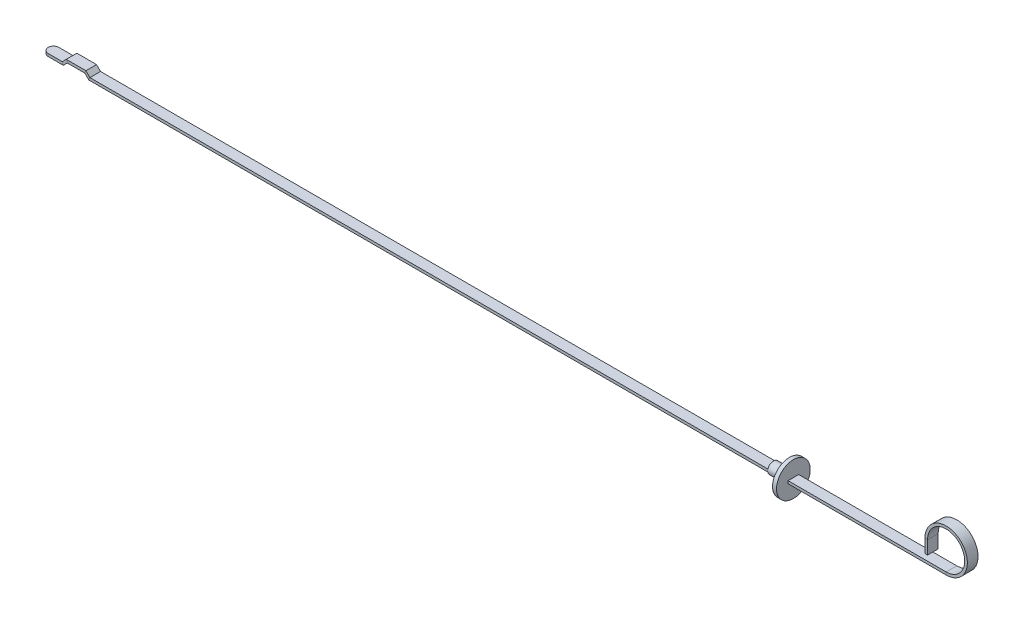
ISO-10303-21;
HEADER;
FILE_DESCRIPTION(('STEP AP214'),'2;1');
FILE_NAME('part.step','',(''),(''),'','','');
FILE_SCHEMA(('AUTOMOTIVE_DESIGN { 1 0 10303 214 1 1 1 1 }'));
ENDSEC;
DATA;
#1=APPLICATION_CONTEXT('core data for automotive mechanical design processes');
#2=APPLICATION_PROTOCOL_DEFINITION('international standard','automotive_design',2000,#1);
#3=PRODUCT_CONTEXT('',#1,'mechanical');
#4=PRODUCT('Part','Part','',(#3));
#5=PRODUCT_RELATED_PRODUCT_CATEGORY('part','',(#4));
#6=PRODUCT_DEFINITION_FORMATION('','',#4);
#7=PRODUCT_DEFINITION_CONTEXT('part definition',#1,'design');
#8=PRODUCT_DEFINITION('design','',#6,#7);
#9=PRODUCT_DEFINITION_SHAPE('','',#8);
#10=(LENGTH_UNIT() NAMED_UNIT(*) SI_UNIT(.MILLI.,.METRE.));
#11=(NAMED_UNIT(*) PLANE_ANGLE_UNIT() SI_UNIT($,.RADIAN.));
#12=(NAMED_UNIT(*) SI_UNIT($,.STERADIAN.) SOLID_ANGLE_UNIT());
#13=UNCERTAINTY_MEASURE_WITH_UNIT(LENGTH_MEASURE(1.E-05),#10,'distance_accuracy_value','');
#14=(GEOMETRIC_REPRESENTATION_CONTEXT(3) GLOBAL_UNCERTAINTY_ASSIGNED_CONTEXT((#13)) GLOBAL_UNIT_ASSIGNED_CONTEXT((#10,
#11,#12)) REPRESENTATION_CONTEXT('',''));
#15=CARTESIAN_POINT('',(0.,0.,0.));
#16=DIRECTION('',(0.,0.,1.));
#17=DIRECTION('',(1.,0.,0.));
#18=AXIS2_PLACEMENT_3D('',#15,#16,#17);
#19=CARTESIAN_POINT('',(-9.,4.35,0.));
#20=DIRECTION('',(-1.,0.,0.));
#21=DIRECTION('',(0.,-1.,0.));
#22=AXIS2_PLACEMENT_3D('',#19,#20,#21);
#23=PLANE('',#22);
#24=DIRECTION('',(0.,-1.,0.));
#25=VECTOR('',#24,1.);
#26=CARTESIAN_POINT('',(-9.,4.35,-4.));
#27=LINE('',#26,#25);
#28=CARTESIAN_POINT('',(-9.,1.,-4.));
#29=VERTEX_POINT('',#28);
#30=CARTESIAN_POINT('',(-9.,-1.,-4.));
#31=VERTEX_POINT('',#30);
#32=EDGE_CURVE('E443',#29,#31,#27,.T.);
#33=ORIENTED_EDGE('',*,*,#32,.F.);
#34=DIRECTION('',(0.,0.,-1.));
#35=VECTOR('',#34,1.);
#36=CARTESIAN_POINT('',(-9.,1.,0.));
#37=LINE('',#36,#35);
#38=CARTESIAN_POINT('',(-9.,1.,4.));
#39=VERTEX_POINT('',#38);
#40=EDGE_CURVE('E439',#39,#29,#37,.T.);
#41=ORIENTED_EDGE('',*,*,#40,.F.);
#42=DIRECTION('',(0.,1.,0.));
#43=VECTOR('',#42,1.);
#44=CARTESIAN_POINT('',(-9.,4.35,4.));
#45=LINE('',#44,#43);
#46=CARTESIAN_POINT('',(-9.00000000000001,-1.,4.));
#47=VERTEX_POINT('',#46);
#48=EDGE_CURVE('E241',#47,#39,#45,.T.);
#49=ORIENTED_EDGE('',*,*,#48,.F.);
#50=DIRECTION('',(0.,0.,1.));
#51=VECTOR('',#50,1.);
#52=CARTESIAN_POINT('',(-9.,-1.,0.));
#53=LINE('',#52,#51);
#54=EDGE_CURVE('E235',#31,#47,#53,.T.);
#55=ORIENTED_EDGE('',*,*,#54,.F.);
#56=EDGE_LOOP('',(#33,#41,#49,#55));
#57=FACE_BOUND('',#56,.T.);
#58=CARTESIAN_POINT('',(-9.,0.,0.));
#59=DIRECTION('',(1.,0.,0.));
#60=DIRECTION('',(0.,1.,0.));
#61=AXIS2_PLACEMENT_3D('',#58,#59,#60);
#62=CIRCLE('',#61,4.35);
#63=CARTESIAN_POINT('',(-9.,4.35,0.));
#64=VERTEX_POINT('',#63);
#65=EDGE_CURVE('E452',#64,#64,#62,.T.);
#66=ORIENTED_EDGE('',*,*,#65,.F.);
#67=EDGE_LOOP('',(#66));
#68=FACE_BOUND('',#67,.T.);
#69=ADVANCED_FACE('F51',(#57,#68),#23,.T.);
#70=CARTESIAN_POINT('',(2.,0.,0.));
#71=DIRECTION('',(1.,0.,0.));
#72=DIRECTION('',(0.,1.,0.));
#73=AXIS2_PLACEMENT_3D('',#70,#71,#72);
#74=TOROIDAL_SURFACE('',#73,6.35,1.);
#75=CARTESIAN_POINT('',(1.,0.,0.));
#76=DIRECTION('',(1.,0.,0.));
#77=DIRECTION('',(0.,1.,0.));
#78=AXIS2_PLACEMENT_3D('',#75,#76,#77);
#79=CIRCLE('',#78,6.35);
#80=CARTESIAN_POINT('',(1.,6.35,0.));
#81=VERTEX_POINT('',#80);
#82=EDGE_CURVE('E467',#81,#81,#79,.T.);
#83=ORIENTED_EDGE('',*,*,#82,.T.);
#84=EDGE_LOOP('',(#83));
#85=FACE_BOUND('',#84,.T.);
#86=CARTESIAN_POINT('',(3.,0.,0.));
#87=DIRECTION('',(1.,0.,0.));
#88=DIRECTION('',(0.,1.,0.));
#89=AXIS2_PLACEMENT_3D('',#86,#87,#88);
#90=CIRCLE('',#89,6.35);
#91=CARTESIAN_POINT('',(3.,6.35,0.));
#92=VERTEX_POINT('',#91);
#93=EDGE_CURVE('E471',#92,#92,#90,.T.);
#94=ORIENTED_EDGE('',*,*,#93,.F.);
#95=EDGE_LOOP('',(#94));
#96=FACE_BOUND('',#95,.T.);
#97=ADVANCED_FACE('F573',(#85,#96),#74,.F.);
#98=CARTESIAN_POINT('',(0.,0.,0.));
#99=DIRECTION('',(1.,0.,0.));
#100=DIRECTION('',(0.,1.,0.));
#101=AXIS2_PLACEMENT_3D('',#98,#99,#100);
#102=CYLINDRICAL_SURFACE('',#101,6.35);
#103=CARTESIAN_POINT('',(0.,0.,0.));
#104=DIRECTION('',(1.,0.,0.));
#105=DIRECTION('',(0.,1.,0.));
#106=AXIS2_PLACEMENT_3D('',#103,#104,#105);
#107=CIRCLE('',#106,6.35);
#108=CARTESIAN_POINT('',(0.,6.35,0.));
#109=VERTEX_POINT('',#108);
#110=EDGE_CURVE('E463',#109,#109,#107,.T.);
#111=ORIENTED_EDGE('',*,*,#110,.T.);
#112=EDGE_LOOP('',(#111));
#113=FACE_BOUND('',#112,.T.);
#114=ORIENTED_EDGE('',*,*,#82,.F.);
#115=EDGE_LOOP('',(#114));
#116=FACE_BOUND('',#115,.T.);
#117=ADVANCED_FACE('F579',(#113,#116),#102,.T.);
#118=CARTESIAN_POINT('',(0.,6.35,0.));
#119=DIRECTION('',(-1.,0.,0.));
#120=DIRECTION('',(0.,-1.,0.));
#121=AXIS2_PLACEMENT_3D('',#118,#119,#120);
#122=PLANE('',#121);
#123=CARTESIAN_POINT('',(0.,0.,0.));
#124=DIRECTION('',(1.,0.,0.));
#125=DIRECTION('',(0.,1.,0.));
#126=AXIS2_PLACEMENT_3D('',#123,#124,#125);
#127=CIRCLE('',#126,4.35);
#128=CARTESIAN_POINT('',(0.,4.35,0.));
#129=VERTEX_POINT('',#128);
#130=EDGE_CURVE('E459',#129,#129,#127,.T.);
#131=ORIENTED_EDGE('',*,*,#130,.T.);
#132=EDGE_LOOP('',(#131));
#133=FACE_BOUND('',#132,.T.);
#134=ORIENTED_EDGE('',*,*,#110,.F.);
#135=EDGE_LOOP('',(#134));
#136=FACE_BOUND('',#135,.T.);
#137=ADVANCED_FACE('F967',(#133,#136),#122,.T.);
#138=CARTESIAN_POINT('',(0.,0.,0.));
#139=DIRECTION('',(1.,0.,0.));
#140=DIRECTION('',(0.,1.,0.));
#141=AXIS2_PLACEMENT_3D('',#138,#139,#140);
#142=CYLINDRICAL_SURFACE('',#141,4.35);
#143=ORIENTED_EDGE('',*,*,#65,.T.);
#144=EDGE_LOOP('',(#143));
#145=FACE_BOUND('',#144,.T.);
#146=ORIENTED_EDGE('',*,*,#130,.F.);
#147=EDGE_LOOP('',(#146));
#148=FACE_BOUND('',#147,.T.);
#149=ADVANCED_FACE('F558',(#145,#148),#142,.T.);
#150=CARTESIAN_POINT('',(6.,0.,0.));
#151=DIRECTION('',(-1.,0.,0.));
#152=DIRECTION('',(0.,-1.,0.));
#153=AXIS2_PLACEMENT_3D('',#150,#151,#152);
#154=CYLINDRICAL_SURFACE('',#153,12.7);
#155=CARTESIAN_POINT('',(6.,0.,0.));
#156=DIRECTION('',(1.,0.,0.));
#157=DIRECTION('',(0.,1.,0.));
#158=AXIS2_PLACEMENT_3D('',#155,#156,#157);
#159=CIRCLE('',#158,12.7);
#160=CARTESIAN_POINT('',(6.,12.7,0.));
#161=VERTEX_POINT('',#160);
#162=EDGE_CURVE('E448',#161,#161,#159,.T.);
#163=ORIENTED_EDGE('',*,*,#162,.F.);
#164=EDGE_LOOP('',(#163));
#165=FACE_BOUND('',#164,.T.);
#166=CARTESIAN_POINT('',(3.,0.,0.));
#167=DIRECTION('',(1.,0.,0.));
#168=DIRECTION('',(0.,1.,0.));
#169=AXIS2_PLACEMENT_3D('',#166,#167,#168);
#170=CIRCLE('',#169,12.7);
#171=CARTESIAN_POINT('',(3.,12.7,0.));
#172=VERTEX_POINT('',#171);
#173=EDGE_CURVE('E447',#172,#172,#170,.T.);
#174=ORIENTED_EDGE('',*,*,#173,.T.);
#175=EDGE_LOOP('',(#174));
#176=FACE_BOUND('',#175,.T.);
#177=ADVANCED_FACE('F552',(#165,#176),#154,.T.);
#178=CARTESIAN_POINT('',(6.,0.,0.));
#179=DIRECTION('',(1.,0.,0.));
#180=DIRECTION('',(0.,1.,0.));
#181=AXIS2_PLACEMENT_3D('',#178,#179,#180);
#182=PLANE('',#181);
#183=DIRECTION('',(0.,1.,0.));
#184=VECTOR('',#183,1.);
#185=CARTESIAN_POINT('',(6.,0.,-4.));
#186=LINE('',#185,#184);
#187=CARTESIAN_POINT('',(6.00000000000001,-1.,-4.));
#188=VERTEX_POINT('',#187);
#189=CARTESIAN_POINT('',(6.,1.,-4.));
#190=VERTEX_POINT('',#189);
#191=EDGE_CURVE('E487',#188,#190,#186,.T.);
#192=ORIENTED_EDGE('',*,*,#191,.F.);
#193=DIRECTION('',(0.,0.,-1.));
#194=VECTOR('',#193,1.);
#195=CARTESIAN_POINT('',(6.,-1.,0.));
#196=LINE('',#195,#194);
#197=CARTESIAN_POINT('',(6.,-1.,4.));
#198=VERTEX_POINT('',#197);
#199=EDGE_CURVE('E475',#198,#188,#196,.T.);
#200=ORIENTED_EDGE('',*,*,#199,.F.);
#201=DIRECTION('',(0.,-1.,0.));
#202=VECTOR('',#201,1.);
#203=CARTESIAN_POINT('',(6.,0.,4.));
#204=LINE('',#203,#202);
#205=CARTESIAN_POINT('',(6.,1.,4.));
#206=VERTEX_POINT('',#205);
#207=EDGE_CURVE('E479',#206,#198,#204,.T.);
#208=ORIENTED_EDGE('',*,*,#207,.F.);
#209=DIRECTION('',(0.,0.,1.));
#210=VECTOR('',#209,1.);
#211=CARTESIAN_POINT('',(6.,1.,0.));
#212=LINE('',#211,#210);
#213=EDGE_CURVE('E483',#190,#206,#212,.T.);
#214=ORIENTED_EDGE('',*,*,#213,.F.);
#215=EDGE_LOOP('',(#192,#200,#208,#214));
#216=FACE_BOUND('',#215,.T.);
#217=ORIENTED_EDGE('',*,*,#162,.T.);
#218=EDGE_LOOP('',(#217));
#219=FACE_BOUND('',#218,.T.);
#220=ADVANCED_FACE('F548',(#216,#219),#182,.T.);
#221=CARTESIAN_POINT('',(3.,0.,0.));
#222=DIRECTION('',(1.,0.,0.));
#223=DIRECTION('',(0.,1.,0.));
#224=AXIS2_PLACEMENT_3D('',#221,#222,#223);
#225=PLANE('',#224);
#226=ORIENTED_EDGE('',*,*,#93,.T.);
#227=EDGE_LOOP('',(#226));
#228=FACE_BOUND('',#227,.T.);
#229=ORIENTED_EDGE('',*,*,#173,.F.);
#230=EDGE_LOOP('',(#229));
#231=FACE_BOUND('',#230,.T.);
#232=ADVANCED_FACE('F551',(#228,#231),#225,.F.);
#233=CARTESIAN_POINT('',(110.,5.,0.));
#234=DIRECTION('',(0.,1.,0.));
#235=DIRECTION('',(0.,0.,1.));
#236=AXIS2_PLACEMENT_3D('',#233,#234,#235);
#237=PLANE('',#236);
#238=DIRECTION('',(1.,0.,0.));
#239=VECTOR('',#238,1.);
#240=CARTESIAN_POINT('',(109.,5.,-4.));
#241=LINE('',#240,#239);
#242=CARTESIAN_POINT('',(109.,5.,-4.));
#243=VERTEX_POINT('',#242);
#244=CARTESIAN_POINT('',(111.,5.,-4.));
#245=VERTEX_POINT('',#244);
#246=EDGE_CURVE('E398',#243,#245,#241,.T.);
#247=ORIENTED_EDGE('',*,*,#246,.T.);
#248=DIRECTION('',(0.,0.,1.));
#249=VECTOR('',#248,1.);
#250=CARTESIAN_POINT('',(111.,5.,4.));
#251=LINE('',#250,#249);
#252=CARTESIAN_POINT('',(111.,5.,4.));
#253=VERTEX_POINT('',#252);
#254=EDGE_CURVE('E379',#245,#253,#251,.T.);
#255=ORIENTED_EDGE('',*,*,#254,.T.);
#256=DIRECTION('',(-1.,0.,0.));
#257=VECTOR('',#256,1.);
#258=CARTESIAN_POINT('',(109.,5.,4.));
#259=LINE('',#258,#257);
#260=CARTESIAN_POINT('',(109.,5.,4.));
#261=VERTEX_POINT('',#260);
#262=EDGE_CURVE('E360',#253,#261,#259,.T.);
#263=ORIENTED_EDGE('',*,*,#262,.T.);
#264=DIRECTION('',(0.,0.,-1.));
#265=VECTOR('',#264,1.);
#266=CARTESIAN_POINT('',(109.,5.,4.));
#267=LINE('',#266,#265);
#268=EDGE_CURVE('E341',#261,#243,#267,.T.);
#269=ORIENTED_EDGE('',*,*,#268,.T.);
#270=EDGE_LOOP('',(#247,#255,#263,#269));
#271=FACE_BOUND('',#270,.T.);
#272=ADVANCED_FACE('F563',(#271),#237,.F.);
#273=CARTESIAN_POINT('',(109.,15.,-4.));
#274=DIRECTION('',(0.,0.,-1.));
#275=DIRECTION('',(-1.,0.,0.));
#276=AXIS2_PLACEMENT_3D('',#273,#274,#275);
#277=PLANE('',#276);
#278=DIRECTION('',(0.,-1.,0.));
#279=VECTOR('',#278,1.);
#280=CARTESIAN_POINT('',(111.,15.,-4.));
#281=LINE('',#280,#279);
#282=CARTESIAN_POINT('',(111.,15.,-4.));
#283=VERTEX_POINT('',#282);
#284=EDGE_CURVE('E382',#283,#245,#281,.T.);
#285=ORIENTED_EDGE('',*,*,#284,.T.);
#286=ORIENTED_EDGE('',*,*,#246,.F.);
#287=DIRECTION('',(0.,-1.,0.));
#288=VECTOR('',#287,1.);
#289=CARTESIAN_POINT('',(109.,15.,-4.));
#290=LINE('',#289,#288);
#291=CARTESIAN_POINT('',(109.,15.,-4.));
#292=VERTEX_POINT('',#291);
#293=EDGE_CURVE('E350',#292,#243,#290,.T.);
#294=ORIENTED_EDGE('',*,*,#293,.F.);
#295=DIRECTION('',(1.,0.,0.));
#296=VECTOR('',#295,1.);
#297=CARTESIAN_POINT('',(109.,15.,-4.));
#298=LINE('',#297,#296);
#299=EDGE_CURVE('E407',#292,#283,#298,.T.);
#300=ORIENTED_EDGE('',*,*,#299,.T.);
#301=EDGE_LOOP('',(#285,#286,#294,#300));
#302=FACE_BOUND('',#301,.T.);
#303=ADVANCED_FACE('F569',(#302),#277,.T.);
#304=CARTESIAN_POINT('',(111.,15.,4.));
#305=DIRECTION('',(1.,0.,0.));
#306=DIRECTION('',(0.,1.,0.));
#307=AXIS2_PLACEMENT_3D('',#304,#305,#306);
#308=PLANE('',#307);
#309=DIRECTION('',(0.,-1.,0.));
#310=VECTOR('',#309,1.);
#311=CARTESIAN_POINT('',(111.,15.,4.));
#312=LINE('',#311,#310);
#313=CARTESIAN_POINT('',(111.,15.,4.));
#314=VERTEX_POINT('',#313);
#315=EDGE_CURVE('E363',#314,#253,#312,.T.);
#316=ORIENTED_EDGE('',*,*,#315,.T.);
#317=ORIENTED_EDGE('',*,*,#254,.F.);
#318=ORIENTED_EDGE('',*,*,#284,.F.);
#319=DIRECTION('',(0.,0.,1.));
#320=VECTOR('',#319,1.);
#321=CARTESIAN_POINT('',(111.,15.,4.));
#322=LINE('',#321,#320);
#323=EDGE_CURVE('E386',#283,#314,#322,.T.);
#324=ORIENTED_EDGE('',*,*,#323,.T.);
#325=EDGE_LOOP('',(#316,#317,#318,#324));
#326=FACE_BOUND('',#325,.T.);
#327=ADVANCED_FACE('F619',(#326),#308,.T.);
#328=CARTESIAN_POINT('',(109.,15.,4.));
#329=DIRECTION('',(0.,0.,1.));
#330=DIRECTION('',(1.,0.,0.));
#331=AXIS2_PLACEMENT_3D('',#328,#329,#330);
#332=PLANE('',#331);
#333=DIRECTION('',(0.,-1.,0.));
#334=VECTOR('',#333,1.);
#335=CARTESIAN_POINT('',(109.,15.,4.));
#336=LINE('',#335,#334);
#337=CARTESIAN_POINT('',(109.,15.,4.));
#338=VERTEX_POINT('',#337);
#339=EDGE_CURVE('E344',#338,#261,#336,.T.);
#340=ORIENTED_EDGE('',*,*,#339,.T.);
#341=ORIENTED_EDGE('',*,*,#262,.F.);
#342=ORIENTED_EDGE('',*,*,#315,.F.);
#343=DIRECTION('',(-1.,0.,0.));
#344=VECTOR('',#343,1.);
#345=CARTESIAN_POINT('',(109.,15.,4.));
#346=LINE('',#345,#344);
#347=EDGE_CURVE('E367',#314,#338,#346,.T.);
#348=ORIENTED_EDGE('',*,*,#347,.T.);
#349=EDGE_LOOP('',(#340,#341,#342,#348));
#350=FACE_BOUND('',#349,.T.);
#351=ADVANCED_FACE('F613',(#350),#332,.T.);
#352=CARTESIAN_POINT('',(109.,15.,4.));
#353=DIRECTION('',(-1.,0.,0.));
#354=DIRECTION('',(0.,-1.,0.));
#355=AXIS2_PLACEMENT_3D('',#352,#353,#354);
#356=PLANE('',#355);
#357=ORIENTED_EDGE('',*,*,#268,.F.);
#358=ORIENTED_EDGE('',*,*,#339,.F.);
#359=DIRECTION('',(0.,0.,-1.));
#360=VECTOR('',#359,1.);
#361=CARTESIAN_POINT('',(109.,15.,4.));
#362=LINE('',#361,#360);
#363=EDGE_CURVE('E345',#338,#292,#362,.T.);
#364=ORIENTED_EDGE('',*,*,#363,.T.);
#365=ORIENTED_EDGE('',*,*,#293,.T.);
#366=EDGE_LOOP('',(#357,#358,#364,#365));
#367=FACE_BOUND('',#366,.T.);
#368=ADVANCED_FACE('F610',(#367),#356,.T.);
#369=CARTESIAN_POINT('',(125.,-0.999999999999986,-4.));
#370=DIRECTION('',(0.,0.,-1.));
#371=DIRECTION('',(-1.,0.,0.));
#372=AXIS2_PLACEMENT_3D('',#369,#370,#371);
#373=PLANE('',#372);
#374=CARTESIAN_POINT('',(125.,15.,-4.));
#375=DIRECTION('',(0.,0.,1.));
#376=DIRECTION('',(0.,-1.,0.));
#377=AXIS2_PLACEMENT_3D('',#374,#375,#376);
#378=CIRCLE('',#377,14.);
#379=CARTESIAN_POINT('',(125.,1.,-4.));
#380=VERTEX_POINT('',#379);
#381=EDGE_CURVE('E390',#380,#283,#378,.T.);
#382=ORIENTED_EDGE('',*,*,#381,.T.);
#383=ORIENTED_EDGE('',*,*,#299,.F.);
#384=CARTESIAN_POINT('',(125.,15.,-4.));
#385=DIRECTION('',(0.,0.,1.));
#386=DIRECTION('',(0.,-1.,0.));
#387=AXIS2_PLACEMENT_3D('',#384,#385,#386);
#388=CIRCLE('',#387,16.);
#389=CARTESIAN_POINT('',(125.,-1.,-4.));
#390=VERTEX_POINT('',#389);
#391=EDGE_CURVE('E356',#390,#292,#388,.T.);
#392=ORIENTED_EDGE('',*,*,#391,.F.);
#393=DIRECTION('',(0.,1.,0.));
#394=VECTOR('',#393,1.);
#395=CARTESIAN_POINT('',(125.,-1.,-4.));
#396=LINE('',#395,#394);
#397=EDGE_CURVE('E394',#390,#380,#396,.T.);
#398=ORIENTED_EDGE('',*,*,#397,.T.);
#399=EDGE_LOOP('',(#382,#383,#392,#398));
#400=FACE_BOUND('',#399,.T.);
#401=ADVANCED_FACE('F525',(#400),#373,.T.);
#402=CARTESIAN_POINT('',(125.,15.,0.));
#403=DIRECTION('',(0.,0.,1.));
#404=DIRECTION('',(1.,0.,0.));
#405=AXIS2_PLACEMENT_3D('',#402,#403,#404);
#406=CYLINDRICAL_SURFACE('',#405,14.);
#407=CARTESIAN_POINT('',(125.,15.,4.));
#408=DIRECTION('',(0.,0.,1.));
#409=DIRECTION('',(0.,-1.,0.));
#410=AXIS2_PLACEMENT_3D('',#407,#408,#409);
#411=CIRCLE('',#410,14.);
#412=CARTESIAN_POINT('',(125.,1.,4.));
#413=VERTEX_POINT('',#412);
#414=EDGE_CURVE('E371',#413,#314,#411,.T.);
#415=ORIENTED_EDGE('',*,*,#414,.T.);
#416=ORIENTED_EDGE('',*,*,#323,.F.);
#417=ORIENTED_EDGE('',*,*,#381,.F.);
#418=DIRECTION('',(0.,0.,1.));
#419=VECTOR('',#418,1.);
#420=CARTESIAN_POINT('',(125.,1.,4.));
#421=LINE('',#420,#419);
#422=EDGE_CURVE('E375',#380,#413,#421,.T.);
#423=ORIENTED_EDGE('',*,*,#422,.T.);
#424=EDGE_LOOP('',(#415,#416,#417,#423));
#425=FACE_BOUND('',#424,.T.);
#426=ADVANCED_FACE('F537',(#425),#406,.F.);
#427=CARTESIAN_POINT('',(125.,-0.999999999999986,4.));
#428=DIRECTION('',(0.,0.,1.));
#429=DIRECTION('',(1.,0.,0.));
#430=AXIS2_PLACEMENT_3D('',#427,#428,#429);
#431=PLANE('',#430);
#432=CARTESIAN_POINT('',(125.,15.,4.));
#433=DIRECTION('',(0.,0.,1.));
#434=DIRECTION('',(0.,-1.,0.));
#435=AXIS2_PLACEMENT_3D('',#432,#433,#434);
#436=CIRCLE('',#435,16.);
#437=CARTESIAN_POINT('',(125.,-1.,4.));
#438=VERTEX_POINT('',#437);
#439=EDGE_CURVE('E349',#438,#338,#436,.T.);
#440=ORIENTED_EDGE('',*,*,#439,.T.);
#441=ORIENTED_EDGE('',*,*,#347,.F.);
#442=ORIENTED_EDGE('',*,*,#414,.F.);
#443=DIRECTION('',(0.,-1.,0.));
#444=VECTOR('',#443,1.);
#445=CARTESIAN_POINT('',(125.,-1.,4.));
#446=LINE('',#445,#444);
#447=EDGE_CURVE('E355',#413,#438,#446,.T.);
#448=ORIENTED_EDGE('',*,*,#447,.T.);
#449=EDGE_LOOP('',(#440,#441,#442,#448));
#450=FACE_BOUND('',#449,.T.);
#451=ADVANCED_FACE('F545',(#450),#431,.T.);
#452=CARTESIAN_POINT('',(125.,15.,0.));
#453=DIRECTION('',(0.,0.,1.));
#454=DIRECTION('',(1.,0.,0.));
#455=AXIS2_PLACEMENT_3D('',#452,#453,#454);
#456=CYLINDRICAL_SURFACE('',#455,16.);
#457=ORIENTED_EDGE('',*,*,#363,.F.);
#458=ORIENTED_EDGE('',*,*,#439,.F.);
#459=DIRECTION('',(0.,0.,-1.));
#460=VECTOR('',#459,1.);
#461=CARTESIAN_POINT('',(125.,-1.,4.));
#462=LINE('',#461,#460);
#463=EDGE_CURVE('E351',#438,#390,#462,.T.);
#464=ORIENTED_EDGE('',*,*,#463,.T.);
#465=ORIENTED_EDGE('',*,*,#391,.T.);
#466=EDGE_LOOP('',(#457,#458,#464,#465));
#467=FACE_BOUND('',#466,.T.);
#468=ADVANCED_FACE('F529',(#467),#456,.T.);
#469=CARTESIAN_POINT('',(-520.555634918611,-1.,4.));
#470=DIRECTION('',(0.,-1.,0.));
#471=DIRECTION('',(1.,0.,0.));
#472=AXIS2_PLACEMENT_3D('',#469,#470,#471);
#473=PLANE('',#472);
#474=DIRECTION('',(1.,0.,0.));
#475=VECTOR('',#474,1.);
#476=CARTESIAN_POINT('',(-520.555634918611,-1.,4.));
#477=LINE('',#476,#475);
#478=EDGE_CURVE('E417',#198,#438,#477,.T.);
#479=ORIENTED_EDGE('',*,*,#478,.F.);
#480=ORIENTED_EDGE('',*,*,#199,.T.);
#481=DIRECTION('',(1.,0.,0.));
#482=VECTOR('',#481,1.);
#483=CARTESIAN_POINT('',(-520.555634918611,-1.,-4.));
#484=LINE('',#483,#482);
#485=EDGE_CURVE('E432',#188,#390,#484,.T.);
#486=ORIENTED_EDGE('',*,*,#485,.T.);
#487=ORIENTED_EDGE('',*,*,#463,.F.);
#488=EDGE_LOOP('',(#479,#480,#486,#487));
#489=FACE_BOUND('',#488,.T.);
#490=ADVANCED_FACE('F520',(#489),#473,.T.);
#491=CARTESIAN_POINT('',(-520.555634918611,-1.,4.));
#492=DIRECTION('',(0.,0.,1.));
#493=DIRECTION('',(1.,0.,0.));
#494=AXIS2_PLACEMENT_3D('',#491,#492,#493);
#495=PLANE('',#494);
#496=DIRECTION('',(1.,0.,0.));
#497=VECTOR('',#496,1.);
#498=CARTESIAN_POINT('',(-520.555634918611,1.,4.));
#499=LINE('',#498,#497);
#500=EDGE_CURVE('E422',#206,#413,#499,.T.);
#501=ORIENTED_EDGE('',*,*,#500,.F.);
#502=ORIENTED_EDGE('',*,*,#207,.T.);
#503=ORIENTED_EDGE('',*,*,#478,.T.);
#504=ORIENTED_EDGE('',*,*,#447,.F.);
#505=EDGE_LOOP('',(#501,#502,#503,#504));
#506=FACE_BOUND('',#505,.T.);
#507=ADVANCED_FACE('F546',(#506),#495,.T.);
#508=CARTESIAN_POINT('',(-520.555634918611,1.,4.));
#509=DIRECTION('',(0.,1.,0.));
#510=DIRECTION('',(-1.,0.,0.));
#511=AXIS2_PLACEMENT_3D('',#508,#509,#510);
#512=PLANE('',#511);
#513=DIRECTION('',(1.,0.,0.));
#514=VECTOR('',#513,1.);
#515=CARTESIAN_POINT('',(-520.555634918611,1.,-4.));
#516=LINE('',#515,#514);
#517=EDGE_CURVE('E427',#190,#380,#516,.T.);
#518=ORIENTED_EDGE('',*,*,#517,.F.);
#519=ORIENTED_EDGE('',*,*,#213,.T.);
#520=ORIENTED_EDGE('',*,*,#500,.T.);
#521=ORIENTED_EDGE('',*,*,#422,.F.);
#522=EDGE_LOOP('',(#518,#519,#520,#521));
#523=FACE_BOUND('',#522,.T.);
#524=ADVANCED_FACE('F538',(#523),#512,.T.);
#525=CARTESIAN_POINT('',(-520.555634918611,-1.,-4.));
#526=DIRECTION('',(0.,0.,-1.));
#527=DIRECTION('',(-1.,0.,0.));
#528=AXIS2_PLACEMENT_3D('',#525,#526,#527);
#529=PLANE('',#528);
#530=ORIENTED_EDGE('',*,*,#485,.F.);
#531=ORIENTED_EDGE('',*,*,#191,.T.);
#532=ORIENTED_EDGE('',*,*,#517,.T.);
#533=ORIENTED_EDGE('',*,*,#397,.F.);
#534=EDGE_LOOP('',(#530,#531,#532,#533));
#535=FACE_BOUND('',#534,.T.);
#536=ADVANCED_FACE('F530',(#535),#529,.T.);
#537=CARTESIAN_POINT('',(-519.585786437627,1.00000000000004,-4.));
#538=VERTEX_POINT('',#537);
#539=EDGE_CURVE('E428',#538,#29,#516,.T.);
#540=ORIENTED_EDGE('',*,*,#539,.T.);
#541=ORIENTED_EDGE('',*,*,#32,.T.);
#542=CARTESIAN_POINT('',(-520.414213562373,-0.99999999999998,-4.));
#543=VERTEX_POINT('',#542);
#544=EDGE_CURVE('E326',#543,#31,#484,.T.);
#545=ORIENTED_EDGE('',*,*,#544,.F.);
#546=DIRECTION('',(-0.38268343236509,-0.923879532511287,0.));
#547=VECTOR('',#546,1.);
#548=CARTESIAN_POINT('',(-519.650862197135,0.842893218813472,-4.));
#549=LINE('',#548,#547);
#550=EDGE_CURVE('E320',#538,#543,#549,.T.);
#551=ORIENTED_EDGE('',*,*,#550,.F.);
#552=EDGE_LOOP('',(#540,#541,#545,#551));
#553=FACE_BOUND('',#552,.T.);
#554=ADVANCED_FACE('F635',(#553),#529,.T.);
#555=CARTESIAN_POINT('',(-519.585786437627,1.00000000000002,4.));
#556=VERTEX_POINT('',#555);
#557=EDGE_CURVE('E423',#556,#39,#499,.T.);
#558=ORIENTED_EDGE('',*,*,#557,.T.);
#559=ORIENTED_EDGE('',*,*,#40,.T.);
#560=ORIENTED_EDGE('',*,*,#539,.F.);
#561=DIRECTION('',(0.,0.,-1.));
#562=VECTOR('',#561,1.);
#563=CARTESIAN_POINT('',(-519.585786437627,1.00000000000006,4.));
#564=LINE('',#563,#562);
#565=EDGE_CURVE('E294',#556,#538,#564,.T.);
#566=ORIENTED_EDGE('',*,*,#565,.F.);
#567=EDGE_LOOP('',(#558,#559,#560,#566));
#568=FACE_BOUND('',#567,.T.);
#569=ADVANCED_FACE('F638',(#568),#512,.T.);
#570=CARTESIAN_POINT('',(-520.414213562373,-0.99999999999998,4.));
#571=VERTEX_POINT('',#570);
#572=EDGE_CURVE('E418',#571,#47,#477,.T.);
#573=ORIENTED_EDGE('',*,*,#572,.T.);
#574=ORIENTED_EDGE('',*,*,#48,.T.);
#575=ORIENTED_EDGE('',*,*,#557,.F.);
#576=DIRECTION('',(0.38268343236509,0.923879532511287,0.));
#577=VECTOR('',#576,1.);
#578=CARTESIAN_POINT('',(-519.650862197135,0.842893218813472,4.));
#579=LINE('',#578,#577);
#580=EDGE_CURVE('E312',#571,#556,#579,.T.);
#581=ORIENTED_EDGE('',*,*,#580,.F.);
#582=EDGE_LOOP('',(#573,#574,#575,#581));
#583=FACE_BOUND('',#582,.T.);
#584=ADVANCED_FACE('F605',(#583),#495,.T.);
#585=ORIENTED_EDGE('',*,*,#544,.T.);
#586=ORIENTED_EDGE('',*,*,#54,.T.);
#587=ORIENTED_EDGE('',*,*,#572,.F.);
#588=DIRECTION('',(0.,0.,1.));
#589=VECTOR('',#588,1.);
#590=CARTESIAN_POINT('',(-520.414213562373,-0.999999999999978,4.));
#591=LINE('',#590,#589);
#592=EDGE_CURVE('E316',#543,#571,#591,.T.);
#593=ORIENTED_EDGE('',*,*,#592,.F.);
#594=EDGE_LOOP('',(#585,#586,#587,#593));
#595=FACE_BOUND('',#594,.T.);
#596=ADVANCED_FACE('F593',(#595),#473,.T.);
#597=CARTESIAN_POINT('',(-524.1,2.68578643762692,4.));
#598=DIRECTION('',(-0.707106781186547,-0.707106781186548,0.));
#599=DIRECTION('',(0.707106781186548,-0.707106781186547,0.));
#600=AXIS2_PLACEMENT_3D('',#597,#598,#599);
#601=PLANE('',#600);
#602=DIRECTION('',(0.707106781186548,-0.707106781186547,0.));
#603=VECTOR('',#602,1.);
#604=CARTESIAN_POINT('',(-524.1,2.68578643762692,-4.));
#605=LINE('',#604,#603);
#606=CARTESIAN_POINT('',(-523.414213562373,2.00000000000002,-4.));
#607=VERTEX_POINT('',#606);
#608=EDGE_CURVE('E334',#607,#543,#605,.T.);
#609=ORIENTED_EDGE('',*,*,#608,.T.);
#610=ORIENTED_EDGE('',*,*,#592,.T.);
#611=DIRECTION('',(0.707106781186548,-0.707106781186547,0.));
#612=VECTOR('',#611,1.);
#613=CARTESIAN_POINT('',(-524.1,2.68578643762692,4.));
#614=LINE('',#613,#612);
#615=CARTESIAN_POINT('',(-523.414213562373,2.00000000000002,4.));
#616=VERTEX_POINT('',#615);
#617=EDGE_CURVE('E321',#616,#571,#614,.T.);
#618=ORIENTED_EDGE('',*,*,#617,.F.);
#619=DIRECTION('',(0.,0.,1.));
#620=VECTOR('',#619,1.);
#621=CARTESIAN_POINT('',(-523.414213562373,2.,4.));
#622=LINE('',#621,#620);
#623=EDGE_CURVE('E284',#607,#616,#622,.T.);
#624=ORIENTED_EDGE('',*,*,#623,.F.);
#625=EDGE_LOOP('',(#609,#610,#618,#624));
#626=FACE_BOUND('',#625,.T.);
#627=ADVANCED_FACE('F588',(#626),#601,.T.);
#628=CARTESIAN_POINT('',(-524.1,2.68578643762692,4.));
#629=DIRECTION('',(0.,0.,1.));
#630=DIRECTION('',(1.,0.,0.));
#631=AXIS2_PLACEMENT_3D('',#628,#629,#630);
#632=PLANE('',#631);
#633=ORIENTED_EDGE('',*,*,#617,.T.);
#634=ORIENTED_EDGE('',*,*,#580,.T.);
#635=DIRECTION('',(0.707106781186548,-0.707106781186547,0.));
#636=VECTOR('',#635,1.);
#637=CARTESIAN_POINT('',(-522.685786437627,4.10000000000002,4.));
#638=LINE('',#637,#636);
#639=CARTESIAN_POINT('',(-522.585786437627,4.00000000000002,4.));
#640=VERTEX_POINT('',#639);
#641=EDGE_CURVE('E325',#640,#556,#638,.T.);
#642=ORIENTED_EDGE('',*,*,#641,.F.);
#643=DIRECTION('',(0.382683432365089,0.923879532511287,0.));
#644=VECTOR('',#643,1.);
#645=CARTESIAN_POINT('',(-525.485176772186,-2.99974746830584,4.));
#646=LINE('',#645,#644);
#647=EDGE_CURVE('E280',#616,#640,#646,.T.);
#648=ORIENTED_EDGE('',*,*,#647,.F.);
#649=EDGE_LOOP('',(#633,#634,#642,#648));
#650=FACE_BOUND('',#649,.T.);
#651=ADVANCED_FACE('F595',(#650),#632,.T.);
#652=CARTESIAN_POINT('',(-522.685786437627,4.10000000000002,4.));
#653=DIRECTION('',(0.707106781186547,0.707106781186548,0.));
#654=DIRECTION('',(-0.707106781186548,0.707106781186547,0.));
#655=AXIS2_PLACEMENT_3D('',#652,#653,#654);
#656=PLANE('',#655);
#657=ORIENTED_EDGE('',*,*,#641,.T.);
#658=ORIENTED_EDGE('',*,*,#565,.T.);
#659=DIRECTION('',(0.707106781186548,-0.707106781186547,0.));
#660=VECTOR('',#659,1.);
#661=CARTESIAN_POINT('',(-522.685786437627,4.10000000000002,-4.));
#662=LINE('',#661,#660);
#663=CARTESIAN_POINT('',(-522.585786437627,4.00000000000004,-4.));
#664=VERTEX_POINT('',#663);
#665=EDGE_CURVE('E330',#664,#538,#662,.T.);
#666=ORIENTED_EDGE('',*,*,#665,.F.);
#667=DIRECTION('',(0.,0.,-1.));
#668=VECTOR('',#667,1.);
#669=CARTESIAN_POINT('',(-522.585786437627,4.,4.));
#670=LINE('',#669,#668);
#671=EDGE_CURVE('E270',#640,#664,#670,.T.);
#672=ORIENTED_EDGE('',*,*,#671,.F.);
#673=EDGE_LOOP('',(#657,#658,#666,#672));
#674=FACE_BOUND('',#673,.T.);
#675=ADVANCED_FACE('F602',(#674),#656,.T.);
#676=CARTESIAN_POINT('',(-524.1,2.68578643762692,-4.));
#677=DIRECTION('',(0.,0.,-1.));
#678=DIRECTION('',(-1.,0.,0.));
#679=AXIS2_PLACEMENT_3D('',#676,#677,#678);
#680=PLANE('',#679);
#681=ORIENTED_EDGE('',*,*,#665,.T.);
#682=ORIENTED_EDGE('',*,*,#550,.T.);
#683=ORIENTED_EDGE('',*,*,#608,.F.);
#684=DIRECTION('',(-0.382683432365089,-0.923879532511287,0.));
#685=VECTOR('',#684,1.);
#686=CARTESIAN_POINT('',(-525.485176772186,-2.99974746830584,-4.));
#687=LINE('',#686,#685);
#688=EDGE_CURVE('E288',#664,#607,#687,.T.);
#689=ORIENTED_EDGE('',*,*,#688,.F.);
#690=EDGE_LOOP('',(#681,#682,#683,#689));
#691=FACE_BOUND('',#690,.T.);
#692=ADVANCED_FACE('F701',(#691),#680,.T.);
#693=CARTESIAN_POINT('',(-537.555634918611,2.,4.));
#694=DIRECTION('',(0.,-1.,0.));
#695=DIRECTION('',(0.,0.,-1.));
#696=AXIS2_PLACEMENT_3D('',#693,#694,#695);
#697=PLANE('',#696);
#698=DIRECTION('',(1.,0.,0.));
#699=VECTOR('',#698,1.);
#700=CARTESIAN_POINT('',(-537.555634918611,2.,-4.));
#701=LINE('',#700,#699);
#702=CARTESIAN_POINT('',(-536.585786437627,1.99999999999996,-4.));
#703=VERTEX_POINT('',#702);
#704=EDGE_CURVE('E302',#703,#607,#701,.T.);
#705=ORIENTED_EDGE('',*,*,#704,.T.);
#706=ORIENTED_EDGE('',*,*,#623,.T.);
#707=DIRECTION('',(1.,0.,0.));
#708=VECTOR('',#707,1.);
#709=CARTESIAN_POINT('',(-537.555634918611,2.,4.));
#710=LINE('',#709,#708);
#711=CARTESIAN_POINT('',(-536.585786437627,1.99999999999996,4.));
#712=VERTEX_POINT('',#711);
#713=EDGE_CURVE('E289',#712,#616,#710,.T.);
#714=ORIENTED_EDGE('',*,*,#713,.F.);
#715=DIRECTION('',(0.,0.,1.));
#716=VECTOR('',#715,1.);
#717=CARTESIAN_POINT('',(-536.585786437627,1.99999999999995,4.));
#718=LINE('',#717,#716);
#719=EDGE_CURVE('E261',#703,#712,#718,.T.);
#720=ORIENTED_EDGE('',*,*,#719,.F.);
#721=EDGE_LOOP('',(#705,#706,#714,#720));
#722=FACE_BOUND('',#721,.T.);
#723=ADVANCED_FACE('F711',(#722),#697,.T.);
#724=CARTESIAN_POINT('',(-537.555634918611,2.,4.));
#725=DIRECTION('',(0.,0.,1.));
#726=DIRECTION('',(1.,0.,0.));
#727=AXIS2_PLACEMENT_3D('',#724,#725,#726);
#728=PLANE('',#727);
#729=ORIENTED_EDGE('',*,*,#713,.T.);
#730=ORIENTED_EDGE('',*,*,#647,.T.);
#731=DIRECTION('',(1.,0.,0.));
#732=VECTOR('',#731,1.);
#733=CARTESIAN_POINT('',(-537.555634918611,4.,4.));
#734=LINE('',#733,#732);
#735=CARTESIAN_POINT('',(-537.414213562373,3.99999999999998,4.));
#736=VERTEX_POINT('',#735);
#737=EDGE_CURVE('E293',#736,#640,#734,.T.);
#738=ORIENTED_EDGE('',*,*,#737,.F.);
#739=DIRECTION('',(-0.382683432365093,0.923879532511285,0.));
#740=VECTOR('',#739,1.);
#741=CARTESIAN_POINT('',(-535.943755415949,0.44999999999994,4.));
#742=LINE('',#741,#740);
#743=EDGE_CURVE('E257',#712,#736,#742,.T.);
#744=ORIENTED_EDGE('',*,*,#743,.F.);
#745=EDGE_LOOP('',(#729,#730,#738,#744));
#746=FACE_BOUND('',#745,.T.);
#747=ADVANCED_FACE('F722',(#746),#728,.T.);
#748=CARTESIAN_POINT('',(-537.555634918611,4.,4.));
#749=DIRECTION('',(0.,1.,0.));
#750=DIRECTION('',(0.,0.,1.));
#751=AXIS2_PLACEMENT_3D('',#748,#749,#750);
#752=PLANE('',#751);
#753=ORIENTED_EDGE('',*,*,#737,.T.);
#754=ORIENTED_EDGE('',*,*,#671,.T.);
#755=DIRECTION('',(1.,0.,0.));
#756=VECTOR('',#755,1.);
#757=CARTESIAN_POINT('',(-537.555634918611,4.,-4.));
#758=LINE('',#757,#756);
#759=CARTESIAN_POINT('',(-537.414213562373,3.99999999999998,-4.));
#760=VERTEX_POINT('',#759);
#761=EDGE_CURVE('E298',#760,#664,#758,.T.);
#762=ORIENTED_EDGE('',*,*,#761,.F.);
#763=DIRECTION('',(0.,0.,-1.));
#764=VECTOR('',#763,1.);
#765=CARTESIAN_POINT('',(-537.414213562373,3.99999999999998,4.));
#766=LINE('',#765,#764);
#767=EDGE_CURVE('E229',#736,#760,#766,.T.);
#768=ORIENTED_EDGE('',*,*,#767,.F.);
#769=EDGE_LOOP('',(#753,#754,#762,#768));
#770=FACE_BOUND('',#769,.T.);
#771=ADVANCED_FACE('F733',(#770),#752,.T.);
#772=CARTESIAN_POINT('',(-537.555634918611,2.,-4.));
#773=DIRECTION('',(0.,0.,-1.));
#774=DIRECTION('',(-1.,0.,0.));
#775=AXIS2_PLACEMENT_3D('',#772,#773,#774);
#776=PLANE('',#775);
#777=ORIENTED_EDGE('',*,*,#761,.T.);
#778=ORIENTED_EDGE('',*,*,#688,.T.);
#779=ORIENTED_EDGE('',*,*,#704,.F.);
#780=DIRECTION('',(0.382683432365093,-0.923879532511285,0.));
#781=VECTOR('',#780,1.);
#782=CARTESIAN_POINT('',(-535.943755415949,0.44999999999994,-4.));
#783=LINE('',#782,#781);
#784=EDGE_CURVE('E265',#760,#703,#783,.T.);
#785=ORIENTED_EDGE('',*,*,#784,.F.);
#786=EDGE_LOOP('',(#777,#778,#779,#785));
#787=FACE_BOUND('',#786,.T.);
#788=ADVANCED_FACE('F744',(#787),#776,.T.);
#789=CARTESIAN_POINT('',(-539.685786437627,-1.10000000000007,4.));
#790=DIRECTION('',(0.707106781186553,-0.707106781186542,0.));
#791=DIRECTION('',(0.707106781186542,0.707106781186553,0.));
#792=AXIS2_PLACEMENT_3D('',#789,#790,#791);
#793=PLANE('',#792);
#794=DIRECTION('',(0.707106781186542,0.707106781186553,0.));
#795=VECTOR('',#794,1.);
#796=CARTESIAN_POINT('',(-539.685786437627,-1.10000000000007,-4.));
#797=LINE('',#796,#795);
#798=CARTESIAN_POINT('',(-539.585786437627,-1.00000000000012,-4.));
#799=VERTEX_POINT('',#798);
#800=EDGE_CURVE('E217',#799,#703,#797,.T.);
#801=ORIENTED_EDGE('',*,*,#800,.T.);
#802=ORIENTED_EDGE('',*,*,#719,.T.);
#803=DIRECTION('',(0.707106781186542,0.707106781186553,0.));
#804=VECTOR('',#803,1.);
#805=CARTESIAN_POINT('',(-539.685786437627,-1.10000000000007,4.));
#806=LINE('',#805,#804);
#807=CARTESIAN_POINT('',(-539.585786437627,-1.00000000000012,4.));
#808=VERTEX_POINT('',#807);
#809=EDGE_CURVE('E266',#808,#712,#806,.T.);
#810=ORIENTED_EDGE('',*,*,#809,.F.);
#811=DIRECTION('',(0.,0.,1.));
#812=VECTOR('',#811,1.);
#813=CARTESIAN_POINT('',(-539.585786437627,-1.00000000000012,4.));
#814=LINE('',#813,#812);
#815=EDGE_CURVE('E219',#799,#808,#814,.T.);
#816=ORIENTED_EDGE('',*,*,#815,.F.);
#817=EDGE_LOOP('',(#801,#802,#810,#816));
#818=FACE_BOUND('',#817,.T.);
#819=ADVANCED_FACE('F755',(#818),#793,.T.);
#820=CARTESIAN_POINT('',(-539.685786437627,-1.10000000000007,4.));
#821=DIRECTION('',(0.,0.,1.));
#822=DIRECTION('',(1.,0.,0.));
#823=AXIS2_PLACEMENT_3D('',#820,#821,#822);
#824=PLANE('',#823);
#825=ORIENTED_EDGE('',*,*,#809,.T.);
#826=ORIENTED_EDGE('',*,*,#743,.T.);
#827=DIRECTION('',(0.707106781186542,0.707106781186553,0.));
#828=VECTOR('',#827,1.);
#829=CARTESIAN_POINT('',(-541.1,0.314213562373015,4.));
#830=LINE('',#829,#828);
#831=CARTESIAN_POINT('',(-540.414213562373,0.999999999999888,4.));
#832=VERTEX_POINT('',#831);
#833=EDGE_CURVE('E231',#832,#736,#830,.T.);
#834=ORIENTED_EDGE('',*,*,#833,.F.);
#835=DIRECTION('',(-0.382683432365094,0.923879532511285,0.));
#836=VECTOR('',#835,1.);
#837=CARTESIAN_POINT('',(-541.843145750508,4.44974746830577,4.));
#838=LINE('',#837,#836);
#839=EDGE_CURVE('E236',#808,#832,#838,.T.);
#840=ORIENTED_EDGE('',*,*,#839,.F.);
#841=EDGE_LOOP('',(#825,#826,#834,#840));
#842=FACE_BOUND('',#841,.T.);
#843=ADVANCED_FACE('F766',(#842),#824,.T.);
#844=CARTESIAN_POINT('',(-541.1,0.314213562373015,4.));
#845=DIRECTION('',(-0.707106781186553,0.707106781186542,0.));
#846=DIRECTION('',(-0.707106781186542,-0.707106781186553,0.));
#847=AXIS2_PLACEMENT_3D('',#844,#845,#846);
#848=PLANE('',#847);
#849=ORIENTED_EDGE('',*,*,#833,.T.);
#850=ORIENTED_EDGE('',*,*,#767,.T.);
#851=DIRECTION('',(0.707106781186542,0.707106781186553,0.));
#852=VECTOR('',#851,1.);
#853=CARTESIAN_POINT('',(-541.1,0.314213562373015,-4.));
#854=LINE('',#853,#852);
#855=CARTESIAN_POINT('',(-540.414213562373,0.999999999999896,-4.));
#856=VERTEX_POINT('',#855);
#857=EDGE_CURVE('E215',#856,#760,#854,.T.);
#858=ORIENTED_EDGE('',*,*,#857,.F.);
#859=DIRECTION('',(0.,0.,-1.));
#860=VECTOR('',#859,1.);
#861=CARTESIAN_POINT('',(-540.414213562373,0.999999999999878,4.));
#862=LINE('',#861,#860);
#863=EDGE_CURVE('E227',#832,#856,#862,.T.);
#864=ORIENTED_EDGE('',*,*,#863,.F.);
#865=EDGE_LOOP('',(#849,#850,#858,#864));
#866=FACE_BOUND('',#865,.T.);
#867=ADVANCED_FACE('F226',(#866),#848,.T.);
#868=CARTESIAN_POINT('',(-539.685786437627,-1.10000000000007,-4.));
#869=DIRECTION('',(0.,0.,-1.));
#870=DIRECTION('',(-1.,0.,0.));
#871=AXIS2_PLACEMENT_3D('',#868,#869,#870);
#872=PLANE('',#871);
#873=ORIENTED_EDGE('',*,*,#857,.T.);
#874=ORIENTED_EDGE('',*,*,#784,.T.);
#875=ORIENTED_EDGE('',*,*,#800,.F.);
#876=DIRECTION('',(0.382683432365094,-0.923879532511285,0.));
#877=VECTOR('',#876,1.);
#878=CARTESIAN_POINT('',(-541.843145750508,4.44974746830577,-4.));
#879=LINE('',#878,#877);
#880=EDGE_CURVE('E200',#856,#799,#879,.T.);
#881=ORIENTED_EDGE('',*,*,#880,.F.);
#882=EDGE_LOOP('',(#873,#874,#875,#881));
#883=FACE_BOUND('',#882,.T.);
#884=ADVANCED_FACE('F213',(#883),#872,.T.);
#885=CARTESIAN_POINT('',(-555.,-1.00000000000012,4.));
#886=DIRECTION('',(0.,-1.,0.));
#887=DIRECTION('',(1.,0.,0.));
#888=AXIS2_PLACEMENT_3D('',#885,#886,#887);
#889=PLANE('',#888);
#890=CARTESIAN_POINT('',(-551.,-1.00000000000012,0.));
#891=DIRECTION('',(0.,-1.,0.));
#892=DIRECTION('',(1.,0.,0.));
#893=AXIS2_PLACEMENT_3D('',#890,#891,#892);
#894=CIRCLE('',#893,4.);
#895=CARTESIAN_POINT('',(-551.,-1.00000000000012,4.));
#896=VERTEX_POINT('',#895);
#897=CARTESIAN_POINT('',(-555.,-1.00000000000012,0.));
#898=VERTEX_POINT('',#897);
#899=EDGE_CURVE('E68',#896,#898,#894,.T.);
#900=ORIENTED_EDGE('',*,*,#899,.T.);
#901=CARTESIAN_POINT('',(-551.,-1.00000000000012,0.));
#902=DIRECTION('',(0.,-1.,0.));
#903=DIRECTION('',(1.,0.,0.));
#904=AXIS2_PLACEMENT_3D('',#901,#902,#903);
#905=CIRCLE('',#904,4.);
#906=CARTESIAN_POINT('',(-551.,-1.00000000000012,-4.));
#907=VERTEX_POINT('',#906);
#908=EDGE_CURVE('E61',#898,#907,#905,.T.);
#909=ORIENTED_EDGE('',*,*,#908,.T.);
#910=DIRECTION('',(1.,0.,0.));
#911=VECTOR('',#910,1.);
#912=CARTESIAN_POINT('',(-555.,-1.00000000000012,-4.));
#913=LINE('',#912,#911);
#914=EDGE_CURVE('E207',#907,#799,#913,.T.);
#915=ORIENTED_EDGE('',*,*,#914,.T.);
#916=ORIENTED_EDGE('',*,*,#815,.T.);
#917=DIRECTION('',(1.,0.,0.));
#918=VECTOR('',#917,1.);
#919=CARTESIAN_POINT('',(-555.,-1.00000000000012,4.));
#920=LINE('',#919,#918);
#921=EDGE_CURVE('E220',#896,#808,#920,.T.);
#922=ORIENTED_EDGE('',*,*,#921,.F.);
#923=EDGE_LOOP('',(#900,#909,#915,#916,#922));
#924=FACE_BOUND('',#923,.T.);
#925=ADVANCED_FACE('F503',(#924),#889,.T.);
#926=CARTESIAN_POINT('',(-555.,-1.00000000000012,4.));
#927=DIRECTION('',(0.,0.,1.));
#928=DIRECTION('',(1.,0.,0.));
#929=AXIS2_PLACEMENT_3D('',#926,#927,#928);
#930=PLANE('',#929);
#931=DIRECTION('',(1.,0.,0.));
#932=VECTOR('',#931,1.);
#933=CARTESIAN_POINT('',(-555.,0.999999999999877,4.));
#934=LINE('',#933,#932);
#935=CARTESIAN_POINT('',(-551.,0.999999999999877,4.));
#936=VERTEX_POINT('',#935);
#937=EDGE_CURVE('E206',#936,#832,#934,.T.);
#938=ORIENTED_EDGE('',*,*,#937,.F.);
#939=DIRECTION('',(0.,-1.,0.));
#940=VECTOR('',#939,1.);
#941=CARTESIAN_POINT('',(-551.,-1.00000000000012,4.));
#942=LINE('',#941,#940);
#943=EDGE_CURVE('E12',#936,#896,#942,.T.);
#944=ORIENTED_EDGE('',*,*,#943,.T.);
#945=ORIENTED_EDGE('',*,*,#921,.T.);
#946=ORIENTED_EDGE('',*,*,#839,.T.);
#947=EDGE_LOOP('',(#938,#944,#945,#946));
#948=FACE_BOUND('',#947,.T.);
#949=ADVANCED_FACE('F805',(#948),#930,.T.);
#950=CARTESIAN_POINT('',(-555.,0.999999999999877,4.));
#951=DIRECTION('',(0.,1.,0.));
#952=DIRECTION('',(-1.,0.,0.));
#953=AXIS2_PLACEMENT_3D('',#950,#951,#952);
#954=PLANE('',#953);
#955=DIRECTION('',(1.,0.,0.));
#956=VECTOR('',#955,1.);
#957=CARTESIAN_POINT('',(-555.,0.999999999999877,-4.));
#958=LINE('',#957,#956);
#959=CARTESIAN_POINT('',(-551.,0.999999999999877,-4.));
#960=VERTEX_POINT('',#959);
#961=EDGE_CURVE('E196',#960,#856,#958,.T.);
#962=ORIENTED_EDGE('',*,*,#961,.F.);
#963=CARTESIAN_POINT('',(-551.,0.999999999999877,0.));
#964=DIRECTION('',(0.,1.,0.));
#965=DIRECTION('',(-1.,0.,0.));
#966=AXIS2_PLACEMENT_3D('',#963,#964,#965);
#967=CIRCLE('',#966,4.);
#968=CARTESIAN_POINT('',(-555.,0.999999999999877,0.));
#969=VERTEX_POINT('',#968);
#970=EDGE_CURVE('E496',#960,#969,#967,.T.);
#971=ORIENTED_EDGE('',*,*,#970,.T.);
#972=CARTESIAN_POINT('',(-551.,0.999999999999877,0.));
#973=DIRECTION('',(0.,1.,0.));
#974=DIRECTION('',(-1.,0.,0.));
#975=AXIS2_PLACEMENT_3D('',#972,#973,#974);
#976=CIRCLE('',#975,4.);
#977=EDGE_CURVE('E493',#969,#936,#976,.T.);
#978=ORIENTED_EDGE('',*,*,#977,.T.);
#979=ORIENTED_EDGE('',*,*,#937,.T.);
#980=ORIENTED_EDGE('',*,*,#863,.T.);
#981=EDGE_LOOP('',(#962,#971,#978,#979,#980));
#982=FACE_BOUND('',#981,.T.);
#983=ADVANCED_FACE('F233',(#982),#954,.T.);
#984=CARTESIAN_POINT('',(-555.,-1.00000000000012,-4.));
#985=DIRECTION('',(0.,0.,-1.));
#986=DIRECTION('',(-1.,0.,0.));
#987=AXIS2_PLACEMENT_3D('',#984,#985,#986);
#988=PLANE('',#987);
#989=ORIENTED_EDGE('',*,*,#914,.F.);
#990=DIRECTION('',(0.,1.,0.));
#991=VECTOR('',#990,1.);
#992=CARTESIAN_POINT('',(-551.,-1.00000000000012,-4.));
#993=LINE('',#992,#991);
#994=EDGE_CURVE('E202',#907,#960,#993,.T.);
#995=ORIENTED_EDGE('',*,*,#994,.T.);
#996=ORIENTED_EDGE('',*,*,#961,.T.);
#997=ORIENTED_EDGE('',*,*,#880,.T.);
#998=EDGE_LOOP('',(#989,#995,#996,#997));
#999=FACE_BOUND('',#998,.T.);
#1000=ADVANCED_FACE('F199',(#999),#988,.T.);
#1001=CARTESIAN_POINT('',(-551.,-1.00000000000012,0.));
#1002=DIRECTION('',(0.,-1.,0.));
#1003=DIRECTION('',(0.,0.,-1.));
#1004=AXIS2_PLACEMENT_3D('',#1001,#1002,#1003);
#1005=CYLINDRICAL_SURFACE('',#1004,4.);
#1006=DIRECTION('',(0.,-1.,0.));
#1007=VECTOR('',#1006,1.);
#1008=CARTESIAN_POINT('',(-555.,-1.23479048583936E-13,0.));
#1009=LINE('',#1008,#1007);
#1010=EDGE_CURVE('E55',#898,#969,#1009,.F.);
#1011=ORIENTED_EDGE('',*,*,#1010,.F.);
#1012=ORIENTED_EDGE('',*,*,#899,.F.);
#1013=ORIENTED_EDGE('',*,*,#943,.F.);
#1014=ORIENTED_EDGE('',*,*,#977,.F.);
#1015=EDGE_LOOP('',(#1011,#1012,#1013,#1014));
#1016=FACE_BOUND('',#1015,.T.);
#1017=ADVANCED_FACE('F53',(#1016),#1005,.T.);
#1018=CARTESIAN_POINT('',(-551.,-1.00000000000012,0.));
#1019=DIRECTION('',(0.,1.,0.));
#1020=DIRECTION('',(0.,0.,1.));
#1021=AXIS2_PLACEMENT_3D('',#1018,#1019,#1020);
#1022=CYLINDRICAL_SURFACE('',#1021,4.);
#1023=ORIENTED_EDGE('',*,*,#908,.F.);
#1024=ORIENTED_EDGE('',*,*,#1010,.T.);
#1025=ORIENTED_EDGE('',*,*,#970,.F.);
#1026=ORIENTED_EDGE('',*,*,#994,.F.);
#1027=EDGE_LOOP('',(#1023,#1024,#1025,#1026));
#1028=FACE_BOUND('',#1027,.T.);
#1029=ADVANCED_FACE('F507',(#1028),#1022,.T.);
#1030=CLOSED_SHELL('',(#69,#97,#117,#137,#149,#177,#220,#232,#272,#303,#327,#351,#368,#401,#426,
#451,#468,#490,#507,#524,#536,#554,#569,#584,#596,#627,#651,#675,#692,#723,#747,#771,#788,#819,
#843,#867,#884,#925,#949,#983,#1000,#1017,#1029));
#1031=MANIFOLD_SOLID_BREP('B2',#1030);
#1032=ADVANCED_BREP_SHAPE_REPRESENTATION('',(#18,#1031),#14);
#1033=SHAPE_DEFINITION_REPRESENTATION(#9,#1032);
ENDSEC;
END-ISO-10303-21;
